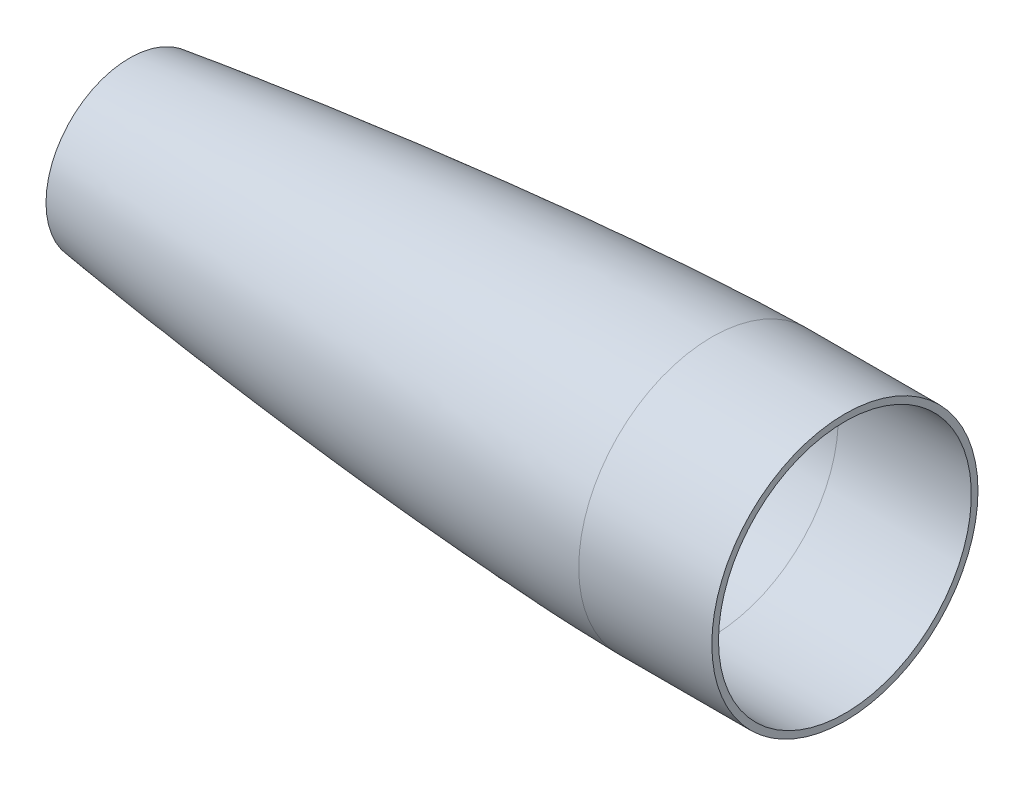
ISO-10303-21;
HEADER;
FILE_DESCRIPTION(('STEP AP214'),'2;1');
FILE_NAME('part.step','',(''),(''),'','','');
FILE_SCHEMA(('AUTOMOTIVE_DESIGN { 1 0 10303 214 1 1 1 1 }'));
ENDSEC;
DATA;
#1=APPLICATION_CONTEXT('core data for automotive mechanical design processes');
#2=APPLICATION_PROTOCOL_DEFINITION('international standard','automotive_design',2000,#1);
#3=PRODUCT_CONTEXT('',#1,'mechanical');
#4=PRODUCT('Part','Part','',(#3));
#5=PRODUCT_RELATED_PRODUCT_CATEGORY('part','',(#4));
#6=PRODUCT_DEFINITION_FORMATION('','',#4);
#7=PRODUCT_DEFINITION_CONTEXT('part definition',#1,'design');
#8=PRODUCT_DEFINITION('design','',#6,#7);
#9=PRODUCT_DEFINITION_SHAPE('','',#8);
#10=(LENGTH_UNIT() NAMED_UNIT(*) SI_UNIT(.MILLI.,.METRE.));
#11=(NAMED_UNIT(*) PLANE_ANGLE_UNIT() SI_UNIT($,.RADIAN.));
#12=(NAMED_UNIT(*) SI_UNIT($,.STERADIAN.) SOLID_ANGLE_UNIT());
#13=UNCERTAINTY_MEASURE_WITH_UNIT(LENGTH_MEASURE(1.E-05),#10,'distance_accuracy_value','');
#14=(GEOMETRIC_REPRESENTATION_CONTEXT(3) GLOBAL_UNCERTAINTY_ASSIGNED_CONTEXT((#13)) GLOBAL_UNIT_ASSIGNED_CONTEXT((#10,
#11,#12)) REPRESENTATION_CONTEXT('',''));
#15=CARTESIAN_POINT('',(0.,0.,0.));
#16=DIRECTION('',(0.,0.,1.));
#17=DIRECTION('',(1.,0.,0.));
#18=AXIS2_PLACEMENT_3D('',#15,#16,#17);
#19=CARTESIAN_POINT('',(127.000000000001,-4.9778557492083E-12,0.));
#20=DIRECTION('',(-1.,0.,0.));
#21=DIRECTION('',(0.,0.,1.));
#22=AXIS2_PLACEMENT_3D('',#19,#20,#21);
#23=PLANE('',#22);
#24=CARTESIAN_POINT('',(127.000000000001,0.,0.));
#25=DIRECTION('',(-1.,0.,0.));
#26=DIRECTION('',(0.,0.,1.));
#27=AXIS2_PLACEMENT_3D('',#24,#25,#26);
#28=CIRCLE('',#27,3.1);
#29=CARTESIAN_POINT('',(127.000000000001,0.,3.1));
#30=VERTEX_POINT('',#29);
#31=EDGE_CURVE('E64',#30,#30,#28,.T.);
#32=ORIENTED_EDGE('',*,*,#31,.T.);
#33=EDGE_LOOP('',(#32));
#34=FACE_BOUND('',#33,.T.);
#35=CARTESIAN_POINT('',(127.000000000003,0.,0.));
#36=DIRECTION('',(-1.,0.,0.));
#37=DIRECTION('',(0.,0.,1.));
#38=AXIS2_PLACEMENT_3D('',#35,#36,#37);
#39=CIRCLE('',#38,23.3682178161958);
#40=CARTESIAN_POINT('',(127.000000000003,0.,23.3682178161958));
#41=VERTEX_POINT('',#40);
#42=EDGE_CURVE('E10',#41,#41,#39,.T.);
#43=ORIENTED_EDGE('',*,*,#42,.F.);
#44=EDGE_LOOP('',(#43));
#45=FACE_BOUND('',#44,.T.);
#46=ADVANCED_FACE('F39',(#34,#45),#23,.F.);
#47=CARTESIAN_POINT('',(1.24104707878723,-1.56837564002814,0.));
#48=CARTESIAN_POINT('',(1.38072651358553,-1.45784806608548,0.));
#49=CARTESIAN_POINT('',(1.68812190962396,-1.21603416491436,0.));
#50=CARTESIAN_POINT('',(1.99972912925921,-1.0017718832655,0.));
#51=CARTESIAN_POINT('',(2.317254102482,-0.833130062730708,0.));
#52=CARTESIAN_POINT('',(2.82322266764752,-0.607386802016348,0.));
#53=CARTESIAN_POINT('',(3.36175977128999,-0.371354779284754,0.));
#54=CARTESIAN_POINT('',(3.78487839678141,-0.192887815098354,0.));
#55=CARTESIAN_POINT('',(4.13245251568203,-0.0528098213867526,0.));
#56=CARTESIAN_POINT('',(4.48128115776574,0.0842151762639861,0.));
#57=CARTESIAN_POINT('',(5.45584521353752,0.455620513214385,0.));
#58=CARTESIAN_POINT('',(7.08336823885096,1.03097689796746,0.));
#59=CARTESIAN_POINT('',(10.0370333872921,1.98400819746106,0.));
#60=CARTESIAN_POINT('',(13.7866787494859,3.07972831387747,0.));
#61=CARTESIAN_POINT('',(18.3316696873954,4.2942089424192,0.));
#62=CARTESIAN_POINT('',(22.9057435798013,5.43459441495826,0.));
#63=CARTESIAN_POINT('',(29.0313588489755,6.87739198279683,0.));
#64=CARTESIAN_POINT('',(36.7254600282243,8.56224762699856,0.));
#65=CARTESIAN_POINT('',(45.9957676007706,10.4449658930179,0.));
#66=CARTESIAN_POINT('',(55.2930086008028,12.2165783911372,0.));
#67=CARTESIAN_POINT('',(64.6107375416672,13.8956335342922,0.));
#68=CARTESIAN_POINT('',(77.0562982477209,16.0276760541962,0.));
#69=CARTESIAN_POINT('',(92.6469493906245,18.5165386046271,0.));
#70=CARTESIAN_POINT('',(108.775528359128,20.8849755306156,0.));
#71=CARTESIAN_POINT('',(121.796602157228,22.6819089705637,0.));
#72=CARTESIAN_POINT('',(134.322203791071,24.3388704206529,0.));
#73=CARTESIAN_POINT('',(155.756797359613,27.0200939986297,0.));
#74=CARTESIAN_POINT('',(186.647560947956,30.4534961373916,0.));
#75=CARTESIAN_POINT('',(218.103688817696,33.3675175340023,0.));
#76=CARTESIAN_POINT('',(243.296405577543,35.3133183674022,0.));
#77=CARTESIAN_POINT('',(262.20468100433,36.5525405920033,0.));
#78=CARTESIAN_POINT('',(277.964515807183,37.3696128328483,0.));
#79=CARTESIAN_POINT('',(290.582066887665,37.830985966726,0.));
#80=CARTESIAN_POINT('',(296.865005199075,37.9833868364714,0.));
#81=CARTESIAN_POINT('',(300.010580524075,38.0000279870682,0.));
#82=B_SPLINE_CURVE_WITH_KNOTS('',3,(#47,#48,#49,#50,#51,#52,#53,#54,#55,#56,#57,#58,#59,#60,#61,
#62,#63,#64,#65,#66,#67,#68,#69,#70,#71,#72,#73,#74,#75,#76,#77,#78,#79,#80,#81),.UNSPECIFIED.,
.F.,.F.,(4,1,1,1,1,1,1,1,1,1,1,1,1,1,1,1,1,1,1,1,1,1,1,1,1,1,1,1,1,1,1,1,4),(0.,0.001953125,
0.00390625,0.005859375,0.0078125,0.009765625,0.01171875,0.0127370681185279,0.0137136306185279,
0.015625,0.0234375,0.03125,0.046875,0.0625,0.078125,0.09375,0.125,0.15625,0.1875,0.21875,0.25,
0.3125,0.375,0.411299824394942,0.442549824394942,0.5,0.625,0.75,0.8125,0.875,0.9375,0.96875,1.),.UNSPECIFIED.);
#83=CARTESIAN_POINT('',(0.,0.,0.));
#84=DIRECTION('',(-1.,0.,0.));
#85=AXIS1_PLACEMENT('',#83,#84);
#86=SURFACE_OF_REVOLUTION('',#82,#85);
#87=CARTESIAN_POINT('',(300.010580524075,0.,0.));
#88=DIRECTION('',(-1.,0.,0.));
#89=DIRECTION('',(0.,0.,1.));
#90=AXIS2_PLACEMENT_3D('',#87,#88,#89);
#91=CIRCLE('',#90,38.0000279870682);
#92=CARTESIAN_POINT('',(300.010580524075,0.,38.0000279870682));
#93=VERTEX_POINT('',#92);
#94=EDGE_CURVE('E45',#93,#93,#91,.T.);
#95=ORIENTED_EDGE('',*,*,#94,.F.);
#96=EDGE_LOOP('',(#95));
#97=FACE_BOUND('',#96,.T.);
#98=ORIENTED_EDGE('',*,*,#42,.T.);
#99=EDGE_LOOP('',(#98));
#100=FACE_BOUND('',#99,.T.);
#101=ADVANCED_FACE('F94',(#97,#100),#86,.T.);
#102=CARTESIAN_POINT('',(0.,0.,0.));
#103=DIRECTION('',(-1.,0.,0.));
#104=DIRECTION('',(0.,0.,1.));
#105=AXIS2_PLACEMENT_3D('',#102,#103,#104);
#106=CYLINDRICAL_SURFACE('',#105,38.0000279870683);
#107=ORIENTED_EDGE('',*,*,#94,.T.);
#108=EDGE_LOOP('',(#107));
#109=FACE_BOUND('',#108,.T.);
#110=CARTESIAN_POINT('',(340.,0.,0.));
#111=DIRECTION('',(-1.,0.,0.));
#112=DIRECTION('',(0.,0.,1.));
#113=AXIS2_PLACEMENT_3D('',#110,#111,#112);
#114=CIRCLE('',#113,38.0000279870683);
#115=CARTESIAN_POINT('',(340.,0.,38.0000279870683));
#116=VERTEX_POINT('',#115);
#117=EDGE_CURVE('E49',#116,#116,#114,.T.);
#118=ORIENTED_EDGE('',*,*,#117,.F.);
#119=EDGE_LOOP('',(#118));
#120=FACE_BOUND('',#119,.T.);
#121=ADVANCED_FACE('F91',(#109,#120),#106,.F.);
#122=CARTESIAN_POINT('',(340.,0.,0.));
#123=DIRECTION('',(1.,0.,0.));
#124=DIRECTION('',(0.,0.,-1.));
#125=AXIS2_PLACEMENT_3D('',#122,#123,#124);
#126=PLANE('',#125);
#127=ORIENTED_EDGE('',*,*,#117,.T.);
#128=EDGE_LOOP('',(#127));
#129=FACE_BOUND('',#128,.T.);
#130=CARTESIAN_POINT('',(340.,0.,0.));
#131=DIRECTION('',(-1.,0.,0.));
#132=DIRECTION('',(0.,0.,1.));
#133=AXIS2_PLACEMENT_3D('',#130,#131,#132);
#134=CIRCLE('',#133,40.);
#135=CARTESIAN_POINT('',(340.,0.,40.));
#136=VERTEX_POINT('',#135);
#137=EDGE_CURVE('E53',#136,#136,#134,.T.);
#138=ORIENTED_EDGE('',*,*,#137,.F.);
#139=EDGE_LOOP('',(#138));
#140=FACE_BOUND('',#139,.T.);
#141=ADVANCED_FACE('F87',(#129,#140),#126,.T.);
#142=CARTESIAN_POINT('',(0.,0.,0.));
#143=DIRECTION('',(-1.,0.,0.));
#144=DIRECTION('',(0.,0.,1.));
#145=AXIS2_PLACEMENT_3D('',#142,#143,#144);
#146=CYLINDRICAL_SURFACE('',#145,40.);
#147=ORIENTED_EDGE('',*,*,#137,.T.);
#148=EDGE_LOOP('',(#147));
#149=FACE_BOUND('',#148,.T.);
#150=CARTESIAN_POINT('',(300.,0.,0.));
#151=DIRECTION('',(-1.,0.,0.));
#152=DIRECTION('',(0.,0.,1.));
#153=AXIS2_PLACEMENT_3D('',#150,#151,#152);
#154=CIRCLE('',#153,40.);
#155=CARTESIAN_POINT('',(300.,0.,40.));
#156=VERTEX_POINT('',#155);
#157=EDGE_CURVE('E58',#156,#156,#154,.T.);
#158=ORIENTED_EDGE('',*,*,#157,.F.);
#159=EDGE_LOOP('',(#158));
#160=FACE_BOUND('',#159,.T.);
#161=ADVANCED_FACE('F82',(#149,#160),#146,.T.);
#162=CARTESIAN_POINT('',(0.,0.,0.));
#163=CARTESIAN_POINT('',(0.323896393262634,0.256297447135239,0.));
#164=CARTESIAN_POINT('',(0.940379358239095,0.744117050602426,0.));
#165=CARTESIAN_POINT('',(1.99283714906622,1.21291786633903,0.));
#166=CARTESIAN_POINT('',(2.99277128443846,1.65032166081216,0.));
#167=CARTESIAN_POINT('',(3.99620415421005,2.04291385710224,0.));
#168=CARTESIAN_POINT('',(4.99697060582525,2.41355230809015,0.));
#169=CARTESIAN_POINT('',(5.99774565368755,2.76504399387535,0.));
#170=CARTESIAN_POINT('',(6.9981725527302,3.10195620254043,0.));
#171=CARTESIAN_POINT('',(7.99849720728867,3.42661692425287,0.));
#172=CARTESIAN_POINT('',(8.99872945022532,3.74092682111023,0.));
#173=CARTESIAN_POINT('',(9.99890813667159,4.04625782751829,0.));
#174=CARTESIAN_POINT('',(10.9990474975061,4.34369370656729,0.));
#175=CARTESIAN_POINT('',(11.9991591740266,4.63409495584576,0.));
#176=CARTESIAN_POINT('',(12.9992501989831,4.91816395650322,0.));
#177=CARTESIAN_POINT('',(13.9993256067944,5.19648266368764,0.));
#178=CARTESIAN_POINT('',(14.9993889127125,5.4695406822866,0.));
#179=CARTESIAN_POINT('',(15.9994426854055,5.73775497981849,0.));
#180=CARTESIAN_POINT('',(17.3321724567388,6.08921898994635,0.));
#181=CARTESIAN_POINT('',(18.9982525032546,6.5181920671296,0.));
#182=CARTESIAN_POINT('',(20.9984841857123,7.0185968595063,0.));
#183=CARTESIAN_POINT('',(22.9986675525131,7.50600110184011,0.));
#184=CARTESIAN_POINT('',(24.9988156194502,7.98171465526033,0.));
#185=CARTESIAN_POINT('',(26.9989372722884,8.44681460604938,0.));
#186=CARTESIAN_POINT('',(28.9990386941849,8.90220089918929,0.));
#187=CARTESIAN_POINT('',(31.3319670554572,9.4229285710353,0.));
#188=CARTESIAN_POINT('',(33.998266819594,10.0042546490427,0.));
#189=CARTESIAN_POINT('',(36.9984584160075,10.6415679493019,0.));
#190=CARTESIAN_POINT('',(39.9986155580764,11.2635666807496,0.));
#191=CARTESIAN_POINT('',(42.9987462103112,11.8715083866843,0.));
#192=CARTESIAN_POINT('',(46.3317810967096,12.5324755753851,0.));
#193=CARTESIAN_POINT('',(49.9981832531877,13.2423277844383,0.));
#194=CARTESIAN_POINT('',(53.9983614357337,13.9971371798957,0.));
#195=CARTESIAN_POINT('',(57.9985101278777,14.7337795689036,0.));
#196=CARTESIAN_POINT('',(62.3316113305231,15.5134428762467,0.));
#197=CARTESIAN_POINT('',(66.9980730377763,16.3323567780594,0.));
#198=CARTESIAN_POINT('',(71.9982437459365,17.186950377425,0.));
#199=CARTESIAN_POINT('',(77.3313876264093,18.0756528107262,0.));
#200=CARTESIAN_POINT('',(82.9978868200694,18.9948605349031,0.));
#201=CARTESIAN_POINT('',(88.9980612187084,19.9411372023154,0.));
#202=CARTESIAN_POINT('',(95.3312357846457,20.9130191155623,0.));
#203=CARTESIAN_POINT('',(101.997759528553,21.9069663836965,0.));
#204=CARTESIAN_POINT('',(108.997925799742,22.9195278739875,0.));
#205=CARTESIAN_POINT('',(116.331118324321,23.9491822875549,0.));
#206=CARTESIAN_POINT('',(123.997654361615,24.9922683976306,0.));
#207=CARTESIAN_POINT('',(131.997805641703,26.0450992251794,0.));
#208=CARTESIAN_POINT('',(140.331004574225,27.1058844403455,0.));
#209=CARTESIAN_POINT('',(148.997541827637,28.1705675323399,0.));
#210=CARTESIAN_POINT('',(157.997673527332,29.234895992323,0.));
#211=CARTESIAN_POINT('',(166.997785275164,30.2586040927451,0.));
#212=CARTESIAN_POINT('',(175.997880060226,31.2421258213195,0.));
#213=CARTESIAN_POINT('',(184.997960366825,32.1856178538444,0.));
#214=CARTESIAN_POINT('',(193.998028034694,33.088962247604,0.));
#215=CARTESIAN_POINT('',(202.66495442781,33.9198194278513,0.));
#216=CARTESIAN_POINT('',(210.99851948009,34.6826295823757,0.));
#217=CARTESIAN_POINT('',(218.665386436039,35.3524590353638,0.));
#218=CARTESIAN_POINT('',(225.998901833017,35.9636602772653,0.));
#219=CARTESIAN_POINT('',(232.998913298108,36.5199263083051,0.));
#220=CARTESIAN_POINT('',(239.665734712772,37.022853053287,0.));
#221=CARTESIAN_POINT('',(245.999211124623,37.4758118111022,0.));
#222=CARTESIAN_POINT('',(251.666003321611,37.8596031297751,0.));
#223=CARTESIAN_POINT('',(256.999453320939,38.2012347538564,0.));
#224=CARTESIAN_POINT('',(261.666221352303,38.4837325384297,0.));
#225=CARTESIAN_POINT('',(265.999648607121,38.7314551830819,0.));
#226=CARTESIAN_POINT('',(269.999647246772,38.947445798693,0.));
#227=CARTESIAN_POINT('',(273.66639346964,39.1330605425131,0.));
#228=CARTESIAN_POINT('',(276.999799586692,39.2911944866831,0.));
#229=CARTESIAN_POINT('',(279.999798447128,39.4247868844515,0.));
#230=CARTESIAN_POINT('',(282.666524002164,39.535197061309,0.));
#231=CARTESIAN_POINT('',(284.999909378139,39.6251815063814,0.));
#232=CARTESIAN_POINT('',(286.99990888022,39.6974558665275,0.));
#233=CARTESIAN_POINT('',(288.999908328475,39.7645007039299,0.));
#234=CARTESIAN_POINT('',(290.666612895283,39.8156188334175,0.));
#235=CARTESIAN_POINT('',(292.333279240572,39.8627758660953,0.));
#236=CARTESIAN_POINT('',(293.66661229564,39.8971379075253,0.));
#237=CARTESIAN_POINT('',(294.99997654764,39.9276045394239,0.));
#238=CARTESIAN_POINT('',(295.999976496313,39.948292861,0.));
#239=CARTESIAN_POINT('',(296.999976130916,39.9666303895254,0.));
#240=CARTESIAN_POINT('',(297.999976806383,39.9819910945337,0.));
#241=CARTESIAN_POINT('',(298.999972803553,39.9947095200535,0.));
#242=CARTESIAN_POINT('',(299.666663127789,39.9982365359221,0.));
#243=CARTESIAN_POINT('',(300.,40.,0.));
#244=B_SPLINE_CURVE_WITH_KNOTS('',3,(#162,#163,#164,#165,#166,#167,#168,#169,#170,#171,#172,
#173,#174,#175,#176,#177,#178,#179,#180,#181,#182,#183,#184,#185,#186,#187,#188,#189,#190,#191,
#192,#193,#194,#195,#196,#197,#198,#199,#200,#201,#202,#203,#204,#205,#206,#207,#208,#209,#210,
#211,#212,#213,#214,#215,#216,#217,#218,#219,#220,#221,#222,#223,#224,#225,#226,#227,#228,#229,
#230,#231,#232,#233,#234,#235,#236,#237,#238,#239,#240,#241,#242,#243),.UNSPECIFIED.,.F.,.F.,(4,
1,1,1,1,1,1,1,1,1,1,1,1,1,1,1,1,1,1,1,1,1,1,1,1,1,1,1,1,1,1,1,1,1,1,1,1,1,1,1,1,1,1,1,1,1,1,1,1,
1,1,1,1,1,1,1,1,1,1,1,1,1,1,1,1,1,1,1,1,1,1,1,1,1,1,1,1,1,1,4),(0.,0.00406440912138943,
0.0077359274081197,0.0113230026073986,0.0148652544365288,0.0183784505664067,0.0218707977116431,
0.0253472199552414,0.0288109497413138,0.032264245794379,0.0357087608654169,0.0391457479594422,
0.0425761841593664,0.0460008490595448,0.049420376638268,0.0528352908061757,0.0562460305059864,
0.059652967891156,0.0664566678302347,0.0732484681258091,0.0800299669217293,0.0868024253151246,
0.0935668594904517,0.100324102755469,0.107074848697818,0.117190040151284,0.127293535504938,
0.137386642055391,0.147470429076649,0.157545784610126,0.170967751393937,0.184377518285529,
0.197776293990668,0.211165084627346,0.227888311290781,0.244598640808731,0.261297226814316,
0.28132138508408,0.301331431325422,0.321328541270165,0.344643469540276,0.367943466732606,
0.391229651529431,0.41782673305063,0.444408212495056,0.470975106155415,0.50084649952962,
0.530701571147497,0.56054120512836,0.590366150948072,0.620177044663999,0.649974425254299,
0.679758747221683,0.70622304578458,0.732677549039468,0.755817348600429,0.778949887917275,
0.802075244923865,0.821891306865437,0.841702158139195,0.858207229687126,0.874708692157805,
0.887907260199423,0.901103509375949,0.914297431093033,0.924191338077442,0.934083923185055,
0.943975179067133,0.950568606984455,0.95716143740682,0.963753667103279,0.970345292489745,
0.9736408773377,0.980231588629099,0.983526713879564,0.986821684659345,0.990116500225325,
0.993411159695483,0.996705661776141,1.),.UNSPECIFIED.);
#245=CARTESIAN_POINT('',(0.,0.,0.));
#246=DIRECTION('',(-1.,0.,0.));
#247=AXIS1_PLACEMENT('',#245,#246);
#248=SURFACE_OF_REVOLUTION('',#244,#247);
#249=ORIENTED_EDGE('',*,*,#157,.T.);
#250=EDGE_LOOP('',(#249));
#251=FACE_BOUND('',#250,.T.);
#252=CARTESIAN_POINT('',(125.000000000001,0.,0.));
#253=DIRECTION('',(-1.,0.,0.));
#254=DIRECTION('',(0.,0.,1.));
#255=AXIS2_PLACEMENT_3D('',#252,#253,#254);
#256=CIRCLE('',#255,25.1201911930361);
#257=CARTESIAN_POINT('',(125.000000000001,0.,25.1201911930361));
#258=VERTEX_POINT('',#257);
#259=EDGE_CURVE('E61',#258,#258,#256,.T.);
#260=ORIENTED_EDGE('',*,*,#259,.F.);
#261=EDGE_LOOP('',(#260));
#262=FACE_BOUND('',#261,.T.);
#263=ADVANCED_FACE('F77',(#251,#262),#248,.F.);
#264=CARTESIAN_POINT('',(125.,-4.00530238139858E-12,0.));
#265=DIRECTION('',(1.,0.,0.));
#266=DIRECTION('',(0.,0.,-1.));
#267=AXIS2_PLACEMENT_3D('',#264,#265,#266);
#268=PLANE('',#267);
#269=CARTESIAN_POINT('',(125.,0.,0.));
#270=DIRECTION('',(-1.,0.,0.));
#271=DIRECTION('',(0.,0.,1.));
#272=AXIS2_PLACEMENT_3D('',#269,#270,#271);
#273=CIRCLE('',#272,3.1);
#274=CARTESIAN_POINT('',(125.,0.,3.1));
#275=VERTEX_POINT('',#274);
#276=EDGE_CURVE('E107',#275,#275,#273,.T.);
#277=ORIENTED_EDGE('',*,*,#276,.F.);
#278=EDGE_LOOP('',(#277));
#279=FACE_BOUND('',#278,.T.);
#280=ORIENTED_EDGE('',*,*,#259,.T.);
#281=EDGE_LOOP('',(#280));
#282=FACE_BOUND('',#281,.T.);
#283=ADVANCED_FACE('F81',(#279,#282),#268,.F.);
#284=CARTESIAN_POINT('',(340.,0.,0.));
#285=DIRECTION('',(-1.,0.,0.));
#286=DIRECTION('',(0.,0.,1.));
#287=AXIS2_PLACEMENT_3D('',#284,#285,#286);
#288=CYLINDRICAL_SURFACE('',#287,3.1);
#289=ORIENTED_EDGE('',*,*,#276,.T.);
#290=EDGE_LOOP('',(#289));
#291=FACE_BOUND('',#290,.T.);
#292=ORIENTED_EDGE('',*,*,#31,.F.);
#293=EDGE_LOOP('',(#292));
#294=FACE_BOUND('',#293,.T.);
#295=ADVANCED_FACE('F112',(#291,#294),#288,.F.);
#296=CLOSED_SHELL('',(#46,#101,#121,#141,#161,#263,#283,#295));
#297=MANIFOLD_SOLID_BREP('B2',#296);
#298=ADVANCED_BREP_SHAPE_REPRESENTATION('',(#18,#297),#14);
#299=SHAPE_DEFINITION_REPRESENTATION(#9,#298);
ENDSEC;
END-ISO-10303-21;
